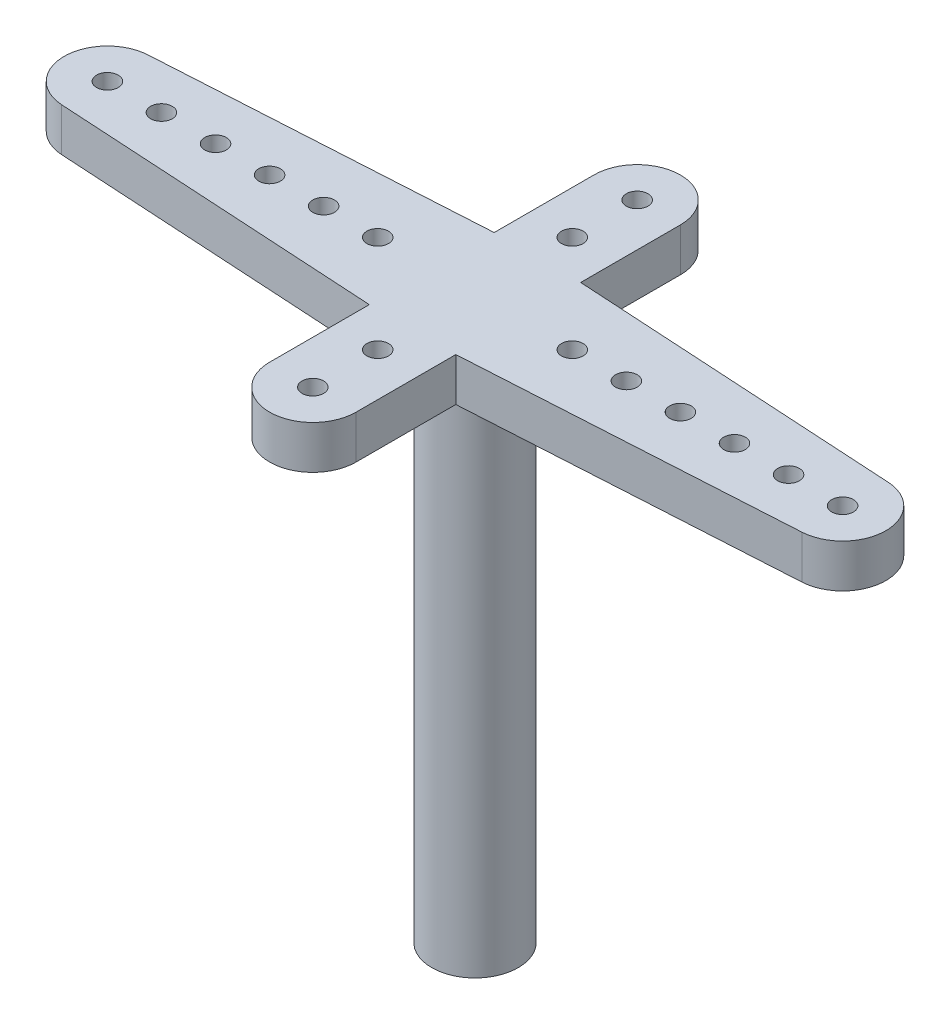
ISO-10303-21;
HEADER;
FILE_DESCRIPTION(('STEP AP214'),'2;1');
FILE_NAME('part.step','',(''),(''),'','','');
FILE_SCHEMA(('AUTOMOTIVE_DESIGN { 1 0 10303 214 1 1 1 1 }'));
ENDSEC;
DATA;
#1=APPLICATION_CONTEXT('core data for automotive mechanical design processes');
#2=APPLICATION_PROTOCOL_DEFINITION('international standard','automotive_design',2000,#1);
#3=PRODUCT_CONTEXT('',#1,'mechanical');
#4=PRODUCT('Part','Part','',(#3));
#5=PRODUCT_RELATED_PRODUCT_CATEGORY('part','',(#4));
#6=PRODUCT_DEFINITION_FORMATION('','',#4);
#7=PRODUCT_DEFINITION_CONTEXT('part definition',#1,'design');
#8=PRODUCT_DEFINITION('design','',#6,#7);
#9=PRODUCT_DEFINITION_SHAPE('','',#8);
#10=(LENGTH_UNIT() NAMED_UNIT(*) SI_UNIT(.MILLI.,.METRE.));
#11=(NAMED_UNIT(*) PLANE_ANGLE_UNIT() SI_UNIT($,.RADIAN.));
#12=(NAMED_UNIT(*) SI_UNIT($,.STERADIAN.) SOLID_ANGLE_UNIT());
#13=UNCERTAINTY_MEASURE_WITH_UNIT(LENGTH_MEASURE(1.E-05),#10,'distance_accuracy_value','');
#14=(GEOMETRIC_REPRESENTATION_CONTEXT(3) GLOBAL_UNCERTAINTY_ASSIGNED_CONTEXT((#13)) GLOBAL_UNIT_ASSIGNED_CONTEXT((#10,
#11,#12)) REPRESENTATION_CONTEXT('',''));
#15=CARTESIAN_POINT('',(0.,0.,0.));
#16=DIRECTION('',(0.,0.,1.));
#17=DIRECTION('',(1.,0.,0.));
#18=AXIS2_PLACEMENT_3D('',#15,#16,#17);
#19=CARTESIAN_POINT('',(17.,2.,0.));
#20=DIRECTION('',(0.,-1.,0.));
#21=DIRECTION('',(0.,0.,-1.));
#22=AXIS2_PLACEMENT_3D('',#19,#20,#21);
#23=PLANE('',#22);
#24=CARTESIAN_POINT('',(17.,2.,0.));
#25=DIRECTION('',(0.,1.,0.));
#26=DIRECTION('',(0.,0.,-1.));
#27=AXIS2_PLACEMENT_3D('',#24,#25,#26);
#28=CIRCLE('',#27,2.);
#29=CARTESIAN_POINT('',(17.1176470588235,2.,1.99653679393849));
#30=VERTEX_POINT('',#29);
#31=CARTESIAN_POINT('',(17.1176470588235,2.,-1.99653679393849));
#32=VERTEX_POINT('',#31);
#33=EDGE_CURVE('E180',#30,#32,#28,.T.);
#34=ORIENTED_EDGE('',*,*,#33,.T.);
#35=DIRECTION('',(-0.998268396969243,0.,-0.0588235294117646));
#36=VECTOR('',#35,1.);
#37=CARTESIAN_POINT('',(17.1176470588235,2.,-1.99653679393849));
#38=LINE('',#37,#36);
#39=CARTESIAN_POINT('',(2.,2.,-2.88735268984507));
#40=VERTEX_POINT('',#39);
#41=EDGE_CURVE('E108',#32,#40,#38,.T.);
#42=ORIENTED_EDGE('',*,*,#41,.T.);
#43=DIRECTION('',(0.,0.,-1.));
#44=VECTOR('',#43,1.);
#45=CARTESIAN_POINT('',(2.,2.,-7.5));
#46=LINE('',#45,#44);
#47=CARTESIAN_POINT('',(2.,2.,-7.5));
#48=VERTEX_POINT('',#47);
#49=EDGE_CURVE('E207',#40,#48,#46,.T.);
#50=ORIENTED_EDGE('',*,*,#49,.T.);
#51=CARTESIAN_POINT('',(0.,2.,-7.5));
#52=DIRECTION('',(0.,1.,0.));
#53=DIRECTION('',(0.,0.,-1.));
#54=AXIS2_PLACEMENT_3D('',#51,#52,#53);
#55=CIRCLE('',#54,2.);
#56=CARTESIAN_POINT('',(-2.,2.,-7.5));
#57=VERTEX_POINT('',#56);
#58=EDGE_CURVE('E226',#48,#57,#55,.T.);
#59=ORIENTED_EDGE('',*,*,#58,.T.);
#60=DIRECTION('',(0.,0.,1.));
#61=VECTOR('',#60,1.);
#62=CARTESIAN_POINT('',(-2.,2.,-7.5));
#63=LINE('',#62,#61);
#64=CARTESIAN_POINT('',(-2.,2.,-2.88735268984507));
#65=VERTEX_POINT('',#64);
#66=EDGE_CURVE('E223',#57,#65,#63,.T.);
#67=ORIENTED_EDGE('',*,*,#66,.T.);
#68=DIRECTION('',(-0.998268396969243,0.,0.0588235294117646));
#69=VECTOR('',#68,1.);
#70=CARTESIAN_POINT('',(-17.1176470588235,2.,-1.99653679393849));
#71=LINE('',#70,#69);
#72=CARTESIAN_POINT('',(-17.1176470588235,2.,-1.99653679393849));
#73=VERTEX_POINT('',#72);
#74=EDGE_CURVE('E225',#65,#73,#71,.T.);
#75=ORIENTED_EDGE('',*,*,#74,.T.);
#76=CARTESIAN_POINT('',(-17.,2.,0.));
#77=DIRECTION('',(0.,1.,0.));
#78=DIRECTION('',(0.,0.,1.));
#79=AXIS2_PLACEMENT_3D('',#76,#77,#78);
#80=CIRCLE('',#79,2.);
#81=CARTESIAN_POINT('',(-17.1176470588235,2.,1.99653679393849));
#82=VERTEX_POINT('',#81);
#83=EDGE_CURVE('E228',#73,#82,#80,.T.);
#84=ORIENTED_EDGE('',*,*,#83,.T.);
#85=DIRECTION('',(0.998268396969243,0.,0.0588235294117647));
#86=VECTOR('',#85,1.);
#87=CARTESIAN_POINT('',(-17.1176470588235,2.,1.99653679393849));
#88=LINE('',#87,#86);
#89=CARTESIAN_POINT('',(-2.,2.,2.88735268984507));
#90=VERTEX_POINT('',#89);
#91=EDGE_CURVE('E234',#82,#90,#88,.T.);
#92=ORIENTED_EDGE('',*,*,#91,.T.);
#93=DIRECTION('',(0.,0.,1.));
#94=VECTOR('',#93,1.);
#95=CARTESIAN_POINT('',(-2.,2.,7.5));
#96=LINE('',#95,#94);
#97=CARTESIAN_POINT('',(-2.,2.,7.5));
#98=VERTEX_POINT('',#97);
#99=EDGE_CURVE('E139',#90,#98,#96,.T.);
#100=ORIENTED_EDGE('',*,*,#99,.T.);
#101=CARTESIAN_POINT('',(0.,2.,7.5));
#102=DIRECTION('',(0.,1.,0.));
#103=DIRECTION('',(0.,0.,1.));
#104=AXIS2_PLACEMENT_3D('',#101,#102,#103);
#105=CIRCLE('',#104,2.);
#106=CARTESIAN_POINT('',(2.,2.,7.5));
#107=VERTEX_POINT('',#106);
#108=EDGE_CURVE('E133',#98,#107,#105,.T.);
#109=ORIENTED_EDGE('',*,*,#108,.T.);
#110=DIRECTION('',(0.,0.,-1.));
#111=VECTOR('',#110,1.);
#112=CARTESIAN_POINT('',(2.,2.,7.5));
#113=LINE('',#112,#111);
#114=CARTESIAN_POINT('',(2.,2.,2.88735268984507));
#115=VERTEX_POINT('',#114);
#116=EDGE_CURVE('E137',#107,#115,#113,.T.);
#117=ORIENTED_EDGE('',*,*,#116,.T.);
#118=DIRECTION('',(0.998268396969243,0.,-0.0588235294117647));
#119=VECTOR('',#118,1.);
#120=CARTESIAN_POINT('',(17.1176470588235,2.,1.99653679393849));
#121=LINE('',#120,#119);
#122=EDGE_CURVE('E53',#115,#30,#121,.T.);
#123=ORIENTED_EDGE('',*,*,#122,.T.);
#124=EDGE_LOOP('',(#34,#42,#50,#59,#67,#75,#84,#92,#100,#109,#117,#123));
#125=FACE_BOUND('',#124,.T.);
#126=CARTESIAN_POINT('',(-17.,2.,0.));
#127=DIRECTION('',(0.,1.,0.));
#128=DIRECTION('',(0.,0.,1.));
#129=AXIS2_PLACEMENT_3D('',#126,#127,#128);
#130=CIRCLE('',#129,0.499999999999999);
#131=CARTESIAN_POINT('',(-17.,2.,0.499999999999999));
#132=VERTEX_POINT('',#131);
#133=EDGE_CURVE('E161',#132,#132,#130,.T.);
#134=ORIENTED_EDGE('',*,*,#133,.F.);
#135=EDGE_LOOP('',(#134));
#136=FACE_BOUND('',#135,.T.);
#137=CARTESIAN_POINT('',(17.,2.,0.));
#138=DIRECTION('',(0.,1.,0.));
#139=DIRECTION('',(0.,0.,-1.));
#140=AXIS2_PLACEMENT_3D('',#137,#138,#139);
#141=CIRCLE('',#140,0.499999999999999);
#142=CARTESIAN_POINT('',(17.,2.,-0.499999999999999));
#143=VERTEX_POINT('',#142);
#144=EDGE_CURVE('E430',#143,#143,#141,.T.);
#145=ORIENTED_EDGE('',*,*,#144,.F.);
#146=EDGE_LOOP('',(#145));
#147=FACE_BOUND('',#146,.T.);
#148=CARTESIAN_POINT('',(-14.5,2.,0.));
#149=DIRECTION('',(0.,1.,0.));
#150=DIRECTION('',(0.,0.,1.));
#151=AXIS2_PLACEMENT_3D('',#148,#149,#150);
#152=CIRCLE('',#151,0.499999999999999);
#153=CARTESIAN_POINT('',(-14.5,2.,0.499999999999999));
#154=VERTEX_POINT('',#153);
#155=EDGE_CURVE('E424',#154,#154,#152,.T.);
#156=ORIENTED_EDGE('',*,*,#155,.F.);
#157=EDGE_LOOP('',(#156));
#158=FACE_BOUND('',#157,.T.);
#159=CARTESIAN_POINT('',(-12.,2.,0.));
#160=DIRECTION('',(0.,1.,0.));
#161=DIRECTION('',(0.,0.,1.));
#162=AXIS2_PLACEMENT_3D('',#159,#160,#161);
#163=CIRCLE('',#162,0.499999999999999);
#164=CARTESIAN_POINT('',(-12.,2.,0.499999999999999));
#165=VERTEX_POINT('',#164);
#166=EDGE_CURVE('E418',#165,#165,#163,.T.);
#167=ORIENTED_EDGE('',*,*,#166,.F.);
#168=EDGE_LOOP('',(#167));
#169=FACE_BOUND('',#168,.T.);
#170=CARTESIAN_POINT('',(-9.5,2.,0.));
#171=DIRECTION('',(0.,1.,0.));
#172=DIRECTION('',(0.,0.,1.));
#173=AXIS2_PLACEMENT_3D('',#170,#171,#172);
#174=CIRCLE('',#173,0.499999999999999);
#175=CARTESIAN_POINT('',(-9.5,2.,0.499999999999999));
#176=VERTEX_POINT('',#175);
#177=EDGE_CURVE('E412',#176,#176,#174,.T.);
#178=ORIENTED_EDGE('',*,*,#177,.F.);
#179=EDGE_LOOP('',(#178));
#180=FACE_BOUND('',#179,.T.);
#181=CARTESIAN_POINT('',(-7.,2.,0.));
#182=DIRECTION('',(0.,1.,0.));
#183=DIRECTION('',(0.,0.,1.));
#184=AXIS2_PLACEMENT_3D('',#181,#182,#183);
#185=CIRCLE('',#184,0.499999999999999);
#186=CARTESIAN_POINT('',(-7.,2.,0.499999999999999));
#187=VERTEX_POINT('',#186);
#188=EDGE_CURVE('E406',#187,#187,#185,.T.);
#189=ORIENTED_EDGE('',*,*,#188,.F.);
#190=EDGE_LOOP('',(#189));
#191=FACE_BOUND('',#190,.T.);
#192=CARTESIAN_POINT('',(-4.5,2.,0.));
#193=DIRECTION('',(0.,1.,0.));
#194=DIRECTION('',(0.,0.,1.));
#195=AXIS2_PLACEMENT_3D('',#192,#193,#194);
#196=CIRCLE('',#195,0.499999999999999);
#197=CARTESIAN_POINT('',(-4.5,2.,0.499999999999999));
#198=VERTEX_POINT('',#197);
#199=EDGE_CURVE('E400',#198,#198,#196,.T.);
#200=ORIENTED_EDGE('',*,*,#199,.F.);
#201=EDGE_LOOP('',(#200));
#202=FACE_BOUND('',#201,.T.);
#203=CARTESIAN_POINT('',(4.5,2.,0.));
#204=DIRECTION('',(0.,1.,0.));
#205=DIRECTION('',(0.,0.,-1.));
#206=AXIS2_PLACEMENT_3D('',#203,#204,#205);
#207=CIRCLE('',#206,0.499999999999999);
#208=CARTESIAN_POINT('',(4.5,2.,-0.499999999999999));
#209=VERTEX_POINT('',#208);
#210=EDGE_CURVE('E394',#209,#209,#207,.T.);
#211=ORIENTED_EDGE('',*,*,#210,.F.);
#212=EDGE_LOOP('',(#211));
#213=FACE_BOUND('',#212,.T.);
#214=CARTESIAN_POINT('',(7.,2.,0.));
#215=DIRECTION('',(0.,1.,0.));
#216=DIRECTION('',(0.,0.,-1.));
#217=AXIS2_PLACEMENT_3D('',#214,#215,#216);
#218=CIRCLE('',#217,0.499999999999999);
#219=CARTESIAN_POINT('',(7.,2.,-0.499999999999999));
#220=VERTEX_POINT('',#219);
#221=EDGE_CURVE('E388',#220,#220,#218,.T.);
#222=ORIENTED_EDGE('',*,*,#221,.F.);
#223=EDGE_LOOP('',(#222));
#224=FACE_BOUND('',#223,.T.);
#225=CARTESIAN_POINT('',(9.5,2.,0.));
#226=DIRECTION('',(0.,1.,0.));
#227=DIRECTION('',(0.,0.,-1.));
#228=AXIS2_PLACEMENT_3D('',#225,#226,#227);
#229=CIRCLE('',#228,0.499999999999999);
#230=CARTESIAN_POINT('',(9.5,2.,-0.499999999999999));
#231=VERTEX_POINT('',#230);
#232=EDGE_CURVE('E382',#231,#231,#229,.T.);
#233=ORIENTED_EDGE('',*,*,#232,.F.);
#234=EDGE_LOOP('',(#233));
#235=FACE_BOUND('',#234,.T.);
#236=CARTESIAN_POINT('',(12.,2.,0.));
#237=DIRECTION('',(0.,1.,0.));
#238=DIRECTION('',(0.,0.,-1.));
#239=AXIS2_PLACEMENT_3D('',#236,#237,#238);
#240=CIRCLE('',#239,0.499999999999999);
#241=CARTESIAN_POINT('',(12.,2.,-0.499999999999999));
#242=VERTEX_POINT('',#241);
#243=EDGE_CURVE('E376',#242,#242,#240,.T.);
#244=ORIENTED_EDGE('',*,*,#243,.F.);
#245=EDGE_LOOP('',(#244));
#246=FACE_BOUND('',#245,.T.);
#247=CARTESIAN_POINT('',(14.5,2.,0.));
#248=DIRECTION('',(0.,1.,0.));
#249=DIRECTION('',(0.,0.,-1.));
#250=AXIS2_PLACEMENT_3D('',#247,#248,#249);
#251=CIRCLE('',#250,0.499999999999999);
#252=CARTESIAN_POINT('',(14.5,2.,-0.499999999999999));
#253=VERTEX_POINT('',#252);
#254=EDGE_CURVE('E370',#253,#253,#251,.T.);
#255=ORIENTED_EDGE('',*,*,#254,.F.);
#256=EDGE_LOOP('',(#255));
#257=FACE_BOUND('',#256,.T.);
#258=CARTESIAN_POINT('',(0.,2.,-7.5));
#259=DIRECTION('',(0.,1.,0.));
#260=DIRECTION('',(0.,0.,1.));
#261=AXIS2_PLACEMENT_3D('',#258,#259,#260);
#262=CIRCLE('',#261,0.5);
#263=CARTESIAN_POINT('',(0.,2.,-7.));
#264=VERTEX_POINT('',#263);
#265=EDGE_CURVE('E364',#264,#264,#262,.T.);
#266=ORIENTED_EDGE('',*,*,#265,.F.);
#267=EDGE_LOOP('',(#266));
#268=FACE_BOUND('',#267,.T.);
#269=CARTESIAN_POINT('',(0.,2.,-4.5));
#270=DIRECTION('',(0.,1.,0.));
#271=DIRECTION('',(0.,0.,1.));
#272=AXIS2_PLACEMENT_3D('',#269,#270,#271);
#273=CIRCLE('',#272,0.5);
#274=CARTESIAN_POINT('',(0.,2.,-4.));
#275=VERTEX_POINT('',#274);
#276=EDGE_CURVE('E358',#275,#275,#273,.T.);
#277=ORIENTED_EDGE('',*,*,#276,.F.);
#278=EDGE_LOOP('',(#277));
#279=FACE_BOUND('',#278,.T.);
#280=CARTESIAN_POINT('',(0.,2.,4.5));
#281=DIRECTION('',(0.,1.,0.));
#282=DIRECTION('',(0.,0.,-1.));
#283=AXIS2_PLACEMENT_3D('',#280,#281,#282);
#284=CIRCLE('',#283,0.5);
#285=CARTESIAN_POINT('',(0.,2.,4.));
#286=VERTEX_POINT('',#285);
#287=EDGE_CURVE('E352',#286,#286,#284,.T.);
#288=ORIENTED_EDGE('',*,*,#287,.F.);
#289=EDGE_LOOP('',(#288));
#290=FACE_BOUND('',#289,.T.);
#291=CARTESIAN_POINT('',(0.,2.,7.5));
#292=DIRECTION('',(0.,1.,0.));
#293=DIRECTION('',(0.,0.,-1.));
#294=AXIS2_PLACEMENT_3D('',#291,#292,#293);
#295=CIRCLE('',#294,0.5);
#296=CARTESIAN_POINT('',(0.,2.,7.));
#297=VERTEX_POINT('',#296);
#298=EDGE_CURVE('E346',#297,#297,#295,.T.);
#299=ORIENTED_EDGE('',*,*,#298,.F.);
#300=EDGE_LOOP('',(#299));
#301=FACE_BOUND('',#300,.T.);
#302=ADVANCED_FACE('F36',(#125,#136,#147,#158,#169,#180,#191,#202,#213,#224,#235,#246,#257,#268,
#279,#290,#301),#23,.F.);
#303=CARTESIAN_POINT('',(17.,0.,0.));
#304=DIRECTION('',(0.,-1.,0.));
#305=DIRECTION('',(0.,0.,-1.));
#306=AXIS2_PLACEMENT_3D('',#303,#304,#305);
#307=PLANE('',#306);
#308=CARTESIAN_POINT('',(0.,0.,4.5));
#309=DIRECTION('',(0.,1.,0.));
#310=DIRECTION('',(0.,0.,-1.));
#311=AXIS2_PLACEMENT_3D('',#308,#309,#310);
#312=CIRCLE('',#311,0.5);
#313=CARTESIAN_POINT('',(0.,0.,4.));
#314=VERTEX_POINT('',#313);
#315=EDGE_CURVE('E349',#314,#314,#312,.T.);
#316=ORIENTED_EDGE('',*,*,#315,.T.);
#317=EDGE_LOOP('',(#316));
#318=FACE_BOUND('',#317,.T.);
#319=CARTESIAN_POINT('',(0.,0.,-7.5));
#320=DIRECTION('',(0.,1.,0.));
#321=DIRECTION('',(0.,0.,1.));
#322=AXIS2_PLACEMENT_3D('',#319,#320,#321);
#323=CIRCLE('',#322,0.5);
#324=CARTESIAN_POINT('',(0.,0.,-7.));
#325=VERTEX_POINT('',#324);
#326=EDGE_CURVE('E361',#325,#325,#323,.T.);
#327=ORIENTED_EDGE('',*,*,#326,.T.);
#328=EDGE_LOOP('',(#327));
#329=FACE_BOUND('',#328,.T.);
#330=CARTESIAN_POINT('',(12.,0.,0.));
#331=DIRECTION('',(0.,1.,0.));
#332=DIRECTION('',(0.,0.,-1.));
#333=AXIS2_PLACEMENT_3D('',#330,#331,#332);
#334=CIRCLE('',#333,0.499999999999999);
#335=CARTESIAN_POINT('',(12.,0.,-0.499999999999999));
#336=VERTEX_POINT('',#335);
#337=EDGE_CURVE('E373',#336,#336,#334,.T.);
#338=ORIENTED_EDGE('',*,*,#337,.T.);
#339=EDGE_LOOP('',(#338));
#340=FACE_BOUND('',#339,.T.);
#341=CARTESIAN_POINT('',(7.,0.,0.));
#342=DIRECTION('',(0.,1.,0.));
#343=DIRECTION('',(0.,0.,-1.));
#344=AXIS2_PLACEMENT_3D('',#341,#342,#343);
#345=CIRCLE('',#344,0.499999999999999);
#346=CARTESIAN_POINT('',(7.,0.,-0.499999999999999));
#347=VERTEX_POINT('',#346);
#348=EDGE_CURVE('E385',#347,#347,#345,.T.);
#349=ORIENTED_EDGE('',*,*,#348,.T.);
#350=EDGE_LOOP('',(#349));
#351=FACE_BOUND('',#350,.T.);
#352=CARTESIAN_POINT('',(-4.5,0.,0.));
#353=DIRECTION('',(0.,1.,0.));
#354=DIRECTION('',(0.,0.,1.));
#355=AXIS2_PLACEMENT_3D('',#352,#353,#354);
#356=CIRCLE('',#355,0.499999999999999);
#357=CARTESIAN_POINT('',(-4.5,0.,0.499999999999999));
#358=VERTEX_POINT('',#357);
#359=EDGE_CURVE('E397',#358,#358,#356,.T.);
#360=ORIENTED_EDGE('',*,*,#359,.T.);
#361=EDGE_LOOP('',(#360));
#362=FACE_BOUND('',#361,.T.);
#363=CARTESIAN_POINT('',(-9.5,0.,0.));
#364=DIRECTION('',(0.,1.,0.));
#365=DIRECTION('',(0.,0.,1.));
#366=AXIS2_PLACEMENT_3D('',#363,#364,#365);
#367=CIRCLE('',#366,0.499999999999999);
#368=CARTESIAN_POINT('',(-9.5,0.,0.499999999999999));
#369=VERTEX_POINT('',#368);
#370=EDGE_CURVE('E409',#369,#369,#367,.T.);
#371=ORIENTED_EDGE('',*,*,#370,.T.);
#372=EDGE_LOOP('',(#371));
#373=FACE_BOUND('',#372,.T.);
#374=CARTESIAN_POINT('',(-14.5,0.,0.));
#375=DIRECTION('',(0.,1.,0.));
#376=DIRECTION('',(0.,0.,1.));
#377=AXIS2_PLACEMENT_3D('',#374,#375,#376);
#378=CIRCLE('',#377,0.499999999999999);
#379=CARTESIAN_POINT('',(-14.5,0.,0.499999999999999));
#380=VERTEX_POINT('',#379);
#381=EDGE_CURVE('E421',#380,#380,#378,.T.);
#382=ORIENTED_EDGE('',*,*,#381,.T.);
#383=EDGE_LOOP('',(#382));
#384=FACE_BOUND('',#383,.T.);
#385=CARTESIAN_POINT('',(-17.,0.,0.));
#386=DIRECTION('',(0.,1.,0.));
#387=DIRECTION('',(0.,0.,1.));
#388=AXIS2_PLACEMENT_3D('',#385,#386,#387);
#389=CIRCLE('',#388,0.499999999999999);
#390=CARTESIAN_POINT('',(-17.,0.,0.499999999999999));
#391=VERTEX_POINT('',#390);
#392=EDGE_CURVE('E433',#391,#391,#389,.T.);
#393=ORIENTED_EDGE('',*,*,#392,.T.);
#394=EDGE_LOOP('',(#393));
#395=FACE_BOUND('',#394,.T.);
#396=CARTESIAN_POINT('',(17.,0.,0.));
#397=DIRECTION('',(0.,1.,0.));
#398=DIRECTION('',(0.,0.,-1.));
#399=AXIS2_PLACEMENT_3D('',#396,#397,#398);
#400=CIRCLE('',#399,2.);
#401=CARTESIAN_POINT('',(17.1176470588235,0.,1.99653679393849));
#402=VERTEX_POINT('',#401);
#403=CARTESIAN_POINT('',(17.1176470588235,0.,-1.99653679393849));
#404=VERTEX_POINT('',#403);
#405=EDGE_CURVE('E157',#402,#404,#400,.T.);
#406=ORIENTED_EDGE('',*,*,#405,.F.);
#407=DIRECTION('',(0.998268396969243,0.,-0.0588235294117647));
#408=VECTOR('',#407,1.);
#409=CARTESIAN_POINT('',(17.1176470588235,0.,1.99653679393849));
#410=LINE('',#409,#408);
#411=CARTESIAN_POINT('',(2.,0.,2.88735268984507));
#412=VERTEX_POINT('',#411);
#413=EDGE_CURVE('E100',#412,#402,#410,.T.);
#414=ORIENTED_EDGE('',*,*,#413,.F.);
#415=DIRECTION('',(0.,0.,-1.));
#416=VECTOR('',#415,1.);
#417=CARTESIAN_POINT('',(2.,0.,7.5));
#418=LINE('',#417,#416);
#419=CARTESIAN_POINT('',(2.,0.,7.5));
#420=VERTEX_POINT('',#419);
#421=EDGE_CURVE('E94',#420,#412,#418,.T.);
#422=ORIENTED_EDGE('',*,*,#421,.F.);
#423=CARTESIAN_POINT('',(0.,0.,7.5));
#424=DIRECTION('',(0.,1.,0.));
#425=DIRECTION('',(0.,0.,1.));
#426=AXIS2_PLACEMENT_3D('',#423,#424,#425);
#427=CIRCLE('',#426,2.);
#428=CARTESIAN_POINT('',(-2.,0.,7.5));
#429=VERTEX_POINT('',#428);
#430=EDGE_CURVE('E147',#429,#420,#427,.T.);
#431=ORIENTED_EDGE('',*,*,#430,.F.);
#432=DIRECTION('',(0.,0.,1.));
#433=VECTOR('',#432,1.);
#434=CARTESIAN_POINT('',(-2.,0.,7.5));
#435=LINE('',#434,#433);
#436=CARTESIAN_POINT('',(-2.,0.,2.88735268984507));
#437=VERTEX_POINT('',#436);
#438=EDGE_CURVE('E175',#437,#429,#435,.T.);
#439=ORIENTED_EDGE('',*,*,#438,.F.);
#440=DIRECTION('',(0.998268396969243,0.,0.0588235294117647));
#441=VECTOR('',#440,1.);
#442=CARTESIAN_POINT('',(-17.1176470588235,0.,1.99653679393849));
#443=LINE('',#442,#441);
#444=CARTESIAN_POINT('',(-17.1176470588235,0.,1.99653679393849));
#445=VERTEX_POINT('',#444);
#446=EDGE_CURVE('E173',#445,#437,#443,.T.);
#447=ORIENTED_EDGE('',*,*,#446,.F.);
#448=CARTESIAN_POINT('',(-17.,0.,0.));
#449=DIRECTION('',(0.,1.,0.));
#450=DIRECTION('',(0.,0.,1.));
#451=AXIS2_PLACEMENT_3D('',#448,#449,#450);
#452=CIRCLE('',#451,2.);
#453=CARTESIAN_POINT('',(-17.1176470588235,0.,-1.99653679393849));
#454=VERTEX_POINT('',#453);
#455=EDGE_CURVE('E171',#454,#445,#452,.T.);
#456=ORIENTED_EDGE('',*,*,#455,.F.);
#457=DIRECTION('',(-0.998268396969243,0.,0.0588235294117646));
#458=VECTOR('',#457,1.);
#459=CARTESIAN_POINT('',(-17.1176470588235,0.,-1.99653679393849));
#460=LINE('',#459,#458);
#461=CARTESIAN_POINT('',(-2.,0.,-2.88735268984507));
#462=VERTEX_POINT('',#461);
#463=EDGE_CURVE('E169',#462,#454,#460,.T.);
#464=ORIENTED_EDGE('',*,*,#463,.F.);
#465=DIRECTION('',(0.,0.,1.));
#466=VECTOR('',#465,1.);
#467=CARTESIAN_POINT('',(-2.,0.,-7.5));
#468=LINE('',#467,#466);
#469=CARTESIAN_POINT('',(-2.,0.,-7.5));
#470=VERTEX_POINT('',#469);
#471=EDGE_CURVE('E167',#470,#462,#468,.T.);
#472=ORIENTED_EDGE('',*,*,#471,.F.);
#473=CARTESIAN_POINT('',(0.,0.,-7.5));
#474=DIRECTION('',(0.,1.,0.));
#475=DIRECTION('',(0.,0.,-1.));
#476=AXIS2_PLACEMENT_3D('',#473,#474,#475);
#477=CIRCLE('',#476,2.);
#478=CARTESIAN_POINT('',(2.,0.,-7.5));
#479=VERTEX_POINT('',#478);
#480=EDGE_CURVE('E165',#479,#470,#477,.T.);
#481=ORIENTED_EDGE('',*,*,#480,.F.);
#482=DIRECTION('',(0.,0.,-1.));
#483=VECTOR('',#482,1.);
#484=CARTESIAN_POINT('',(2.,0.,-7.5));
#485=LINE('',#484,#483);
#486=CARTESIAN_POINT('',(2.,0.,-2.88735268984507));
#487=VERTEX_POINT('',#486);
#488=EDGE_CURVE('E163',#487,#479,#485,.T.);
#489=ORIENTED_EDGE('',*,*,#488,.F.);
#490=DIRECTION('',(-0.998268396969243,0.,-0.0588235294117646));
#491=VECTOR('',#490,1.);
#492=CARTESIAN_POINT('',(17.1176470588235,0.,-1.99653679393849));
#493=LINE('',#492,#491);
#494=EDGE_CURVE('E160',#404,#487,#493,.T.);
#495=ORIENTED_EDGE('',*,*,#494,.F.);
#496=EDGE_LOOP('',(#406,#414,#422,#431,#439,#447,#456,#464,#472,#481,#489,#495));
#497=FACE_BOUND('',#496,.T.);
#498=CARTESIAN_POINT('',(0.,0.,0.));
#499=DIRECTION('',(0.,-1.,0.));
#500=DIRECTION('',(0.,0.,-1.));
#501=AXIS2_PLACEMENT_3D('',#498,#499,#500);
#502=CIRCLE('',#501,2.);
#503=CARTESIAN_POINT('',(0.,0.,2.));
#504=VERTEX_POINT('',#503);
#505=EDGE_CURVE('E340',#504,#504,#502,.F.);
#506=ORIENTED_EDGE('',*,*,#505,.T.);
#507=EDGE_LOOP('',(#506));
#508=FACE_BOUND('',#507,.T.);
#509=CARTESIAN_POINT('',(17.,0.,0.));
#510=DIRECTION('',(0.,1.,0.));
#511=DIRECTION('',(0.,0.,-1.));
#512=AXIS2_PLACEMENT_3D('',#509,#510,#511);
#513=CIRCLE('',#512,0.499999999999999);
#514=CARTESIAN_POINT('',(17.,0.,-0.499999999999999));
#515=VERTEX_POINT('',#514);
#516=EDGE_CURVE('E427',#515,#515,#513,.T.);
#517=ORIENTED_EDGE('',*,*,#516,.T.);
#518=EDGE_LOOP('',(#517));
#519=FACE_BOUND('',#518,.T.);
#520=CARTESIAN_POINT('',(-12.,0.,0.));
#521=DIRECTION('',(0.,1.,0.));
#522=DIRECTION('',(0.,0.,1.));
#523=AXIS2_PLACEMENT_3D('',#520,#521,#522);
#524=CIRCLE('',#523,0.499999999999999);
#525=CARTESIAN_POINT('',(-12.,0.,0.499999999999999));
#526=VERTEX_POINT('',#525);
#527=EDGE_CURVE('E415',#526,#526,#524,.T.);
#528=ORIENTED_EDGE('',*,*,#527,.T.);
#529=EDGE_LOOP('',(#528));
#530=FACE_BOUND('',#529,.T.);
#531=CARTESIAN_POINT('',(-7.,0.,0.));
#532=DIRECTION('',(0.,1.,0.));
#533=DIRECTION('',(0.,0.,1.));
#534=AXIS2_PLACEMENT_3D('',#531,#532,#533);
#535=CIRCLE('',#534,0.499999999999999);
#536=CARTESIAN_POINT('',(-7.,0.,0.499999999999999));
#537=VERTEX_POINT('',#536);
#538=EDGE_CURVE('E403',#537,#537,#535,.T.);
#539=ORIENTED_EDGE('',*,*,#538,.T.);
#540=EDGE_LOOP('',(#539));
#541=FACE_BOUND('',#540,.T.);
#542=CARTESIAN_POINT('',(4.5,0.,0.));
#543=DIRECTION('',(0.,1.,0.));
#544=DIRECTION('',(0.,0.,-1.));
#545=AXIS2_PLACEMENT_3D('',#542,#543,#544);
#546=CIRCLE('',#545,0.499999999999999);
#547=CARTESIAN_POINT('',(4.5,0.,-0.499999999999999));
#548=VERTEX_POINT('',#547);
#549=EDGE_CURVE('E391',#548,#548,#546,.T.);
#550=ORIENTED_EDGE('',*,*,#549,.T.);
#551=EDGE_LOOP('',(#550));
#552=FACE_BOUND('',#551,.T.);
#553=CARTESIAN_POINT('',(9.5,0.,0.));
#554=DIRECTION('',(0.,1.,0.));
#555=DIRECTION('',(0.,0.,-1.));
#556=AXIS2_PLACEMENT_3D('',#553,#554,#555);
#557=CIRCLE('',#556,0.499999999999999);
#558=CARTESIAN_POINT('',(9.5,0.,-0.499999999999999));
#559=VERTEX_POINT('',#558);
#560=EDGE_CURVE('E379',#559,#559,#557,.T.);
#561=ORIENTED_EDGE('',*,*,#560,.T.);
#562=EDGE_LOOP('',(#561));
#563=FACE_BOUND('',#562,.T.);
#564=CARTESIAN_POINT('',(14.5,0.,0.));
#565=DIRECTION('',(0.,1.,0.));
#566=DIRECTION('',(0.,0.,-1.));
#567=AXIS2_PLACEMENT_3D('',#564,#565,#566);
#568=CIRCLE('',#567,0.499999999999999);
#569=CARTESIAN_POINT('',(14.5,0.,-0.499999999999999));
#570=VERTEX_POINT('',#569);
#571=EDGE_CURVE('E367',#570,#570,#568,.T.);
#572=ORIENTED_EDGE('',*,*,#571,.T.);
#573=EDGE_LOOP('',(#572));
#574=FACE_BOUND('',#573,.T.);
#575=CARTESIAN_POINT('',(0.,0.,-4.5));
#576=DIRECTION('',(0.,1.,0.));
#577=DIRECTION('',(0.,0.,1.));
#578=AXIS2_PLACEMENT_3D('',#575,#576,#577);
#579=CIRCLE('',#578,0.5);
#580=CARTESIAN_POINT('',(0.,0.,-4.));
#581=VERTEX_POINT('',#580);
#582=EDGE_CURVE('E355',#581,#581,#579,.T.);
#583=ORIENTED_EDGE('',*,*,#582,.T.);
#584=EDGE_LOOP('',(#583));
#585=FACE_BOUND('',#584,.T.);
#586=CARTESIAN_POINT('',(0.,0.,7.5));
#587=DIRECTION('',(0.,1.,0.));
#588=DIRECTION('',(0.,0.,-1.));
#589=AXIS2_PLACEMENT_3D('',#586,#587,#588);
#590=CIRCLE('',#589,0.5);
#591=CARTESIAN_POINT('',(0.,0.,7.));
#592=VERTEX_POINT('',#591);
#593=EDGE_CURVE('E343',#592,#592,#590,.T.);
#594=ORIENTED_EDGE('',*,*,#593,.T.);
#595=EDGE_LOOP('',(#594));
#596=FACE_BOUND('',#595,.T.);
#597=ADVANCED_FACE('F211',(#318,#329,#340,#351,#362,#373,#384,#395,#497,#508,#519,#530,#541,
#552,#563,#574,#585,#596),#307,.T.);
#598=CARTESIAN_POINT('',(17.,2.,0.));
#599=DIRECTION('',(0.,-1.,0.));
#600=DIRECTION('',(0.,0.,-1.));
#601=AXIS2_PLACEMENT_3D('',#598,#599,#600);
#602=CYLINDRICAL_SURFACE('',#601,2.);
#603=ORIENTED_EDGE('',*,*,#405,.T.);
#604=DIRECTION('',(0.,-1.,0.));
#605=VECTOR('',#604,1.);
#606=CARTESIAN_POINT('',(17.1176470588235,2.,-1.99653679393849));
#607=LINE('',#606,#605);
#608=EDGE_CURVE('E11',#32,#404,#607,.T.);
#609=ORIENTED_EDGE('',*,*,#608,.F.);
#610=ORIENTED_EDGE('',*,*,#33,.F.);
#611=DIRECTION('',(0.,-1.,0.));
#612=VECTOR('',#611,1.);
#613=CARTESIAN_POINT('',(17.1176470588235,2.,1.99653679393849));
#614=LINE('',#613,#612);
#615=EDGE_CURVE('E153',#30,#402,#614,.T.);
#616=ORIENTED_EDGE('',*,*,#615,.T.);
#617=EDGE_LOOP('',(#603,#609,#610,#616));
#618=FACE_BOUND('',#617,.T.);
#619=ADVANCED_FACE('F38',(#618),#602,.T.);
#620=CARTESIAN_POINT('',(17.1176470588235,2.,-1.99653679393849));
#621=DIRECTION('',(-0.0588235294117647,0.,0.998268396969244));
#622=DIRECTION('',(0.998268396969244,0.,0.0588235294117647));
#623=AXIS2_PLACEMENT_3D('',#620,#621,#622);
#624=PLANE('',#623);
#625=ORIENTED_EDGE('',*,*,#494,.T.);
#626=DIRECTION('',(0.,-1.,0.));
#627=VECTOR('',#626,1.);
#628=CARTESIAN_POINT('',(2.,2.,-2.88735268984507));
#629=LINE('',#628,#627);
#630=EDGE_CURVE('E45',#40,#487,#629,.T.);
#631=ORIENTED_EDGE('',*,*,#630,.F.);
#632=ORIENTED_EDGE('',*,*,#41,.F.);
#633=ORIENTED_EDGE('',*,*,#608,.T.);
#634=EDGE_LOOP('',(#625,#631,#632,#633));
#635=FACE_BOUND('',#634,.T.);
#636=ADVANCED_FACE('F667',(#635),#624,.F.);
#637=CARTESIAN_POINT('',(2.,2.,-7.5));
#638=DIRECTION('',(-1.,0.,0.));
#639=DIRECTION('',(0.,0.,1.));
#640=AXIS2_PLACEMENT_3D('',#637,#638,#639);
#641=PLANE('',#640);
#642=ORIENTED_EDGE('',*,*,#488,.T.);
#643=DIRECTION('',(0.,-1.,0.));
#644=VECTOR('',#643,1.);
#645=CARTESIAN_POINT('',(2.,2.,-7.5));
#646=LINE('',#645,#644);
#647=EDGE_CURVE('E199',#48,#479,#646,.T.);
#648=ORIENTED_EDGE('',*,*,#647,.F.);
#649=ORIENTED_EDGE('',*,*,#49,.F.);
#650=ORIENTED_EDGE('',*,*,#630,.T.);
#651=EDGE_LOOP('',(#642,#648,#649,#650));
#652=FACE_BOUND('',#651,.T.);
#653=ADVANCED_FACE('F205',(#652),#641,.F.);
#654=CARTESIAN_POINT('',(0.,2.,-7.5));
#655=DIRECTION('',(0.,-1.,0.));
#656=DIRECTION('',(0.,0.,-1.));
#657=AXIS2_PLACEMENT_3D('',#654,#655,#656);
#658=CYLINDRICAL_SURFACE('',#657,2.);
#659=ORIENTED_EDGE('',*,*,#480,.T.);
#660=DIRECTION('',(0.,-1.,0.));
#661=VECTOR('',#660,1.);
#662=CARTESIAN_POINT('',(-2.,2.,-7.5));
#663=LINE('',#662,#661);
#664=EDGE_CURVE('E196',#57,#470,#663,.T.);
#665=ORIENTED_EDGE('',*,*,#664,.F.);
#666=ORIENTED_EDGE('',*,*,#58,.F.);
#667=ORIENTED_EDGE('',*,*,#647,.T.);
#668=EDGE_LOOP('',(#659,#665,#666,#667));
#669=FACE_BOUND('',#668,.T.);
#670=ADVANCED_FACE('F217',(#669),#658,.T.);
#671=CARTESIAN_POINT('',(-2.,2.,-7.5));
#672=DIRECTION('',(1.,0.,0.));
#673=DIRECTION('',(0.,0.,-1.));
#674=AXIS2_PLACEMENT_3D('',#671,#672,#673);
#675=PLANE('',#674);
#676=ORIENTED_EDGE('',*,*,#471,.T.);
#677=DIRECTION('',(0.,-1.,0.));
#678=VECTOR('',#677,1.);
#679=CARTESIAN_POINT('',(-2.,2.,-2.88735268984507));
#680=LINE('',#679,#678);
#681=EDGE_CURVE('E193',#65,#462,#680,.T.);
#682=ORIENTED_EDGE('',*,*,#681,.F.);
#683=ORIENTED_EDGE('',*,*,#66,.F.);
#684=ORIENTED_EDGE('',*,*,#664,.T.);
#685=EDGE_LOOP('',(#676,#682,#683,#684));
#686=FACE_BOUND('',#685,.T.);
#687=ADVANCED_FACE('F221',(#686),#675,.F.);
#688=CARTESIAN_POINT('',(-17.1176470588235,2.,-1.99653679393849));
#689=DIRECTION('',(0.0588235294117647,0.,0.998268396969244));
#690=DIRECTION('',(0.998268396969244,0.,-0.0588235294117647));
#691=AXIS2_PLACEMENT_3D('',#688,#689,#690);
#692=PLANE('',#691);
#693=ORIENTED_EDGE('',*,*,#463,.T.);
#694=DIRECTION('',(0.,-1.,0.));
#695=VECTOR('',#694,1.);
#696=CARTESIAN_POINT('',(-17.1176470588235,2.,-1.99653679393849));
#697=LINE('',#696,#695);
#698=EDGE_CURVE('E190',#73,#454,#697,.T.);
#699=ORIENTED_EDGE('',*,*,#698,.F.);
#700=ORIENTED_EDGE('',*,*,#74,.F.);
#701=ORIENTED_EDGE('',*,*,#681,.T.);
#702=EDGE_LOOP('',(#693,#699,#700,#701));
#703=FACE_BOUND('',#702,.T.);
#704=ADVANCED_FACE('F632',(#703),#692,.F.);
#705=CARTESIAN_POINT('',(-17.,2.,0.));
#706=DIRECTION('',(0.,-1.,0.));
#707=DIRECTION('',(0.,0.,-1.));
#708=AXIS2_PLACEMENT_3D('',#705,#706,#707);
#709=CYLINDRICAL_SURFACE('',#708,2.);
#710=ORIENTED_EDGE('',*,*,#455,.T.);
#711=DIRECTION('',(0.,-1.,0.));
#712=VECTOR('',#711,1.);
#713=CARTESIAN_POINT('',(-17.1176470588235,2.,1.99653679393849));
#714=LINE('',#713,#712);
#715=EDGE_CURVE('E187',#82,#445,#714,.T.);
#716=ORIENTED_EDGE('',*,*,#715,.F.);
#717=ORIENTED_EDGE('',*,*,#83,.F.);
#718=ORIENTED_EDGE('',*,*,#698,.T.);
#719=EDGE_LOOP('',(#710,#716,#717,#718));
#720=FACE_BOUND('',#719,.T.);
#721=ADVANCED_FACE('F623',(#720),#709,.T.);
#722=CARTESIAN_POINT('',(-17.1176470588235,2.,1.99653679393849));
#723=DIRECTION('',(0.0588235294117647,0.,-0.998268396969244));
#724=DIRECTION('',(-0.998268396969244,0.,-0.0588235294117647));
#725=AXIS2_PLACEMENT_3D('',#722,#723,#724);
#726=PLANE('',#725);
#727=ORIENTED_EDGE('',*,*,#446,.T.);
#728=DIRECTION('',(0.,-1.,0.));
#729=VECTOR('',#728,1.);
#730=CARTESIAN_POINT('',(-2.,2.,2.88735268984507));
#731=LINE('',#730,#729);
#732=EDGE_CURVE('E184',#90,#437,#731,.T.);
#733=ORIENTED_EDGE('',*,*,#732,.F.);
#734=ORIENTED_EDGE('',*,*,#91,.F.);
#735=ORIENTED_EDGE('',*,*,#715,.T.);
#736=EDGE_LOOP('',(#727,#733,#734,#735));
#737=FACE_BOUND('',#736,.T.);
#738=ADVANCED_FACE('F240',(#737),#726,.F.);
#739=CARTESIAN_POINT('',(-2.,2.,7.5));
#740=DIRECTION('',(1.,0.,0.));
#741=DIRECTION('',(0.,0.,-1.));
#742=AXIS2_PLACEMENT_3D('',#739,#740,#741);
#743=PLANE('',#742);
#744=ORIENTED_EDGE('',*,*,#438,.T.);
#745=DIRECTION('',(0.,-1.,0.));
#746=VECTOR('',#745,1.);
#747=CARTESIAN_POINT('',(-2.,2.,7.5));
#748=LINE('',#747,#746);
#749=EDGE_CURVE('E148',#98,#429,#748,.T.);
#750=ORIENTED_EDGE('',*,*,#749,.F.);
#751=ORIENTED_EDGE('',*,*,#99,.F.);
#752=ORIENTED_EDGE('',*,*,#732,.T.);
#753=EDGE_LOOP('',(#744,#750,#751,#752));
#754=FACE_BOUND('',#753,.T.);
#755=ADVANCED_FACE('F244',(#754),#743,.F.);
#756=CARTESIAN_POINT('',(0.,2.,7.5));
#757=DIRECTION('',(0.,-1.,0.));
#758=DIRECTION('',(0.,0.,-1.));
#759=AXIS2_PLACEMENT_3D('',#756,#757,#758);
#760=CYLINDRICAL_SURFACE('',#759,2.);
#761=ORIENTED_EDGE('',*,*,#430,.T.);
#762=DIRECTION('',(0.,-1.,0.));
#763=VECTOR('',#762,1.);
#764=CARTESIAN_POINT('',(2.,2.,7.5));
#765=LINE('',#764,#763);
#766=EDGE_CURVE('E144',#107,#420,#765,.T.);
#767=ORIENTED_EDGE('',*,*,#766,.F.);
#768=ORIENTED_EDGE('',*,*,#108,.F.);
#769=ORIENTED_EDGE('',*,*,#749,.T.);
#770=EDGE_LOOP('',(#761,#767,#768,#769));
#771=FACE_BOUND('',#770,.T.);
#772=ADVANCED_FACE('F145',(#771),#760,.T.);
#773=CARTESIAN_POINT('',(2.,2.,7.5));
#774=DIRECTION('',(-1.,0.,0.));
#775=DIRECTION('',(0.,0.,1.));
#776=AXIS2_PLACEMENT_3D('',#773,#774,#775);
#777=PLANE('',#776);
#778=ORIENTED_EDGE('',*,*,#421,.T.);
#779=DIRECTION('',(0.,-1.,0.));
#780=VECTOR('',#779,1.);
#781=CARTESIAN_POINT('',(2.,2.,2.88735268984507));
#782=LINE('',#781,#780);
#783=EDGE_CURVE('E149',#115,#412,#782,.T.);
#784=ORIENTED_EDGE('',*,*,#783,.F.);
#785=ORIENTED_EDGE('',*,*,#116,.F.);
#786=ORIENTED_EDGE('',*,*,#766,.T.);
#787=EDGE_LOOP('',(#778,#784,#785,#786));
#788=FACE_BOUND('',#787,.T.);
#789=ADVANCED_FACE('F151',(#788),#777,.F.);
#790=CARTESIAN_POINT('',(17.1176470588235,2.,1.99653679393849));
#791=DIRECTION('',(-0.0588235294117647,0.,-0.998268396969244));
#792=DIRECTION('',(-0.998268396969244,0.,0.0588235294117647));
#793=AXIS2_PLACEMENT_3D('',#790,#791,#792);
#794=PLANE('',#793);
#795=ORIENTED_EDGE('',*,*,#413,.T.);
#796=ORIENTED_EDGE('',*,*,#615,.F.);
#797=ORIENTED_EDGE('',*,*,#122,.F.);
#798=ORIENTED_EDGE('',*,*,#783,.T.);
#799=EDGE_LOOP('',(#795,#796,#797,#798));
#800=FACE_BOUND('',#799,.T.);
#801=ADVANCED_FACE('F248',(#800),#794,.F.);
#802=CARTESIAN_POINT('',(-17.,2.,0.));
#803=DIRECTION('',(0.,-1.,0.));
#804=DIRECTION('',(0.,0.,-1.));
#805=AXIS2_PLACEMENT_3D('',#802,#803,#804);
#806=CYLINDRICAL_SURFACE('',#805,0.499999999999999);
#807=ORIENTED_EDGE('',*,*,#133,.T.);
#808=EDGE_LOOP('',(#807));
#809=FACE_BOUND('',#808,.T.);
#810=ORIENTED_EDGE('',*,*,#392,.F.);
#811=EDGE_LOOP('',(#810));
#812=FACE_BOUND('',#811,.T.);
#813=ADVANCED_FACE('F250',(#809,#812),#806,.F.);
#814=CARTESIAN_POINT('',(17.,2.,0.));
#815=DIRECTION('',(0.,-1.,0.));
#816=DIRECTION('',(0.,0.,-1.));
#817=AXIS2_PLACEMENT_3D('',#814,#815,#816);
#818=CYLINDRICAL_SURFACE('',#817,0.499999999999999);
#819=ORIENTED_EDGE('',*,*,#144,.T.);
#820=EDGE_LOOP('',(#819));
#821=FACE_BOUND('',#820,.T.);
#822=ORIENTED_EDGE('',*,*,#516,.F.);
#823=EDGE_LOOP('',(#822));
#824=FACE_BOUND('',#823,.T.);
#825=ADVANCED_FACE('F256',(#821,#824),#818,.F.);
#826=CARTESIAN_POINT('',(-14.5,2.,0.));
#827=DIRECTION('',(0.,-1.,0.));
#828=DIRECTION('',(0.,0.,-1.));
#829=AXIS2_PLACEMENT_3D('',#826,#827,#828);
#830=CYLINDRICAL_SURFACE('',#829,0.499999999999999);
#831=ORIENTED_EDGE('',*,*,#155,.T.);
#832=EDGE_LOOP('',(#831));
#833=FACE_BOUND('',#832,.T.);
#834=ORIENTED_EDGE('',*,*,#381,.F.);
#835=EDGE_LOOP('',(#834));
#836=FACE_BOUND('',#835,.T.);
#837=ADVANCED_FACE('F270',(#833,#836),#830,.F.);
#838=CARTESIAN_POINT('',(-12.,2.,0.));
#839=DIRECTION('',(0.,-1.,0.));
#840=DIRECTION('',(0.,0.,-1.));
#841=AXIS2_PLACEMENT_3D('',#838,#839,#840);
#842=CYLINDRICAL_SURFACE('',#841,0.499999999999999);
#843=ORIENTED_EDGE('',*,*,#166,.T.);
#844=EDGE_LOOP('',(#843));
#845=FACE_BOUND('',#844,.T.);
#846=ORIENTED_EDGE('',*,*,#527,.F.);
#847=EDGE_LOOP('',(#846));
#848=FACE_BOUND('',#847,.T.);
#849=ADVANCED_FACE('F274',(#845,#848),#842,.F.);
#850=CARTESIAN_POINT('',(-9.5,2.,0.));
#851=DIRECTION('',(0.,-1.,0.));
#852=DIRECTION('',(0.,0.,-1.));
#853=AXIS2_PLACEMENT_3D('',#850,#851,#852);
#854=CYLINDRICAL_SURFACE('',#853,0.499999999999999);
#855=ORIENTED_EDGE('',*,*,#177,.T.);
#856=EDGE_LOOP('',(#855));
#857=FACE_BOUND('',#856,.T.);
#858=ORIENTED_EDGE('',*,*,#370,.F.);
#859=EDGE_LOOP('',(#858));
#860=FACE_BOUND('',#859,.T.);
#861=ADVANCED_FACE('F278',(#857,#860),#854,.F.);
#862=CARTESIAN_POINT('',(-7.,2.,0.));
#863=DIRECTION('',(0.,-1.,0.));
#864=DIRECTION('',(0.,0.,-1.));
#865=AXIS2_PLACEMENT_3D('',#862,#863,#864);
#866=CYLINDRICAL_SURFACE('',#865,0.499999999999999);
#867=ORIENTED_EDGE('',*,*,#188,.T.);
#868=EDGE_LOOP('',(#867));
#869=FACE_BOUND('',#868,.T.);
#870=ORIENTED_EDGE('',*,*,#538,.F.);
#871=EDGE_LOOP('',(#870));
#872=FACE_BOUND('',#871,.T.);
#873=ADVANCED_FACE('F282',(#869,#872),#866,.F.);
#874=CARTESIAN_POINT('',(-4.5,2.,0.));
#875=DIRECTION('',(0.,-1.,0.));
#876=DIRECTION('',(0.,0.,-1.));
#877=AXIS2_PLACEMENT_3D('',#874,#875,#876);
#878=CYLINDRICAL_SURFACE('',#877,0.499999999999999);
#879=ORIENTED_EDGE('',*,*,#199,.T.);
#880=EDGE_LOOP('',(#879));
#881=FACE_BOUND('',#880,.T.);
#882=ORIENTED_EDGE('',*,*,#359,.F.);
#883=EDGE_LOOP('',(#882));
#884=FACE_BOUND('',#883,.T.);
#885=ADVANCED_FACE('F286',(#881,#884),#878,.F.);
#886=CARTESIAN_POINT('',(4.5,2.,0.));
#887=DIRECTION('',(0.,-1.,0.));
#888=DIRECTION('',(0.,0.,-1.));
#889=AXIS2_PLACEMENT_3D('',#886,#887,#888);
#890=CYLINDRICAL_SURFACE('',#889,0.499999999999999);
#891=ORIENTED_EDGE('',*,*,#210,.T.);
#892=EDGE_LOOP('',(#891));
#893=FACE_BOUND('',#892,.T.);
#894=ORIENTED_EDGE('',*,*,#549,.F.);
#895=EDGE_LOOP('',(#894));
#896=FACE_BOUND('',#895,.T.);
#897=ADVANCED_FACE('F290',(#893,#896),#890,.F.);
#898=CARTESIAN_POINT('',(7.,2.,0.));
#899=DIRECTION('',(0.,-1.,0.));
#900=DIRECTION('',(0.,0.,-1.));
#901=AXIS2_PLACEMENT_3D('',#898,#899,#900);
#902=CYLINDRICAL_SURFACE('',#901,0.499999999999999);
#903=ORIENTED_EDGE('',*,*,#221,.T.);
#904=EDGE_LOOP('',(#903));
#905=FACE_BOUND('',#904,.T.);
#906=ORIENTED_EDGE('',*,*,#348,.F.);
#907=EDGE_LOOP('',(#906));
#908=FACE_BOUND('',#907,.T.);
#909=ADVANCED_FACE('F294',(#905,#908),#902,.F.);
#910=CARTESIAN_POINT('',(9.5,2.,0.));
#911=DIRECTION('',(0.,-1.,0.));
#912=DIRECTION('',(0.,0.,-1.));
#913=AXIS2_PLACEMENT_3D('',#910,#911,#912);
#914=CYLINDRICAL_SURFACE('',#913,0.499999999999999);
#915=ORIENTED_EDGE('',*,*,#232,.T.);
#916=EDGE_LOOP('',(#915));
#917=FACE_BOUND('',#916,.T.);
#918=ORIENTED_EDGE('',*,*,#560,.F.);
#919=EDGE_LOOP('',(#918));
#920=FACE_BOUND('',#919,.T.);
#921=ADVANCED_FACE('F298',(#917,#920),#914,.F.);
#922=CARTESIAN_POINT('',(12.,2.,0.));
#923=DIRECTION('',(0.,-1.,0.));
#924=DIRECTION('',(0.,0.,-1.));
#925=AXIS2_PLACEMENT_3D('',#922,#923,#924);
#926=CYLINDRICAL_SURFACE('',#925,0.499999999999999);
#927=ORIENTED_EDGE('',*,*,#243,.T.);
#928=EDGE_LOOP('',(#927));
#929=FACE_BOUND('',#928,.T.);
#930=ORIENTED_EDGE('',*,*,#337,.F.);
#931=EDGE_LOOP('',(#930));
#932=FACE_BOUND('',#931,.T.);
#933=ADVANCED_FACE('F302',(#929,#932),#926,.F.);
#934=CARTESIAN_POINT('',(14.5,2.,0.));
#935=DIRECTION('',(0.,-1.,0.));
#936=DIRECTION('',(0.,0.,-1.));
#937=AXIS2_PLACEMENT_3D('',#934,#935,#936);
#938=CYLINDRICAL_SURFACE('',#937,0.499999999999999);
#939=ORIENTED_EDGE('',*,*,#254,.T.);
#940=EDGE_LOOP('',(#939));
#941=FACE_BOUND('',#940,.T.);
#942=ORIENTED_EDGE('',*,*,#571,.F.);
#943=EDGE_LOOP('',(#942));
#944=FACE_BOUND('',#943,.T.);
#945=ADVANCED_FACE('F306',(#941,#944),#938,.F.);
#946=CARTESIAN_POINT('',(0.,2.,-7.5));
#947=DIRECTION('',(0.,-1.,0.));
#948=DIRECTION('',(0.,0.,-1.));
#949=AXIS2_PLACEMENT_3D('',#946,#947,#948);
#950=CYLINDRICAL_SURFACE('',#949,0.5);
#951=ORIENTED_EDGE('',*,*,#265,.T.);
#952=EDGE_LOOP('',(#951));
#953=FACE_BOUND('',#952,.T.);
#954=ORIENTED_EDGE('',*,*,#326,.F.);
#955=EDGE_LOOP('',(#954));
#956=FACE_BOUND('',#955,.T.);
#957=ADVANCED_FACE('F310',(#953,#956),#950,.F.);
#958=CARTESIAN_POINT('',(0.,2.,-4.5));
#959=DIRECTION('',(0.,-1.,0.));
#960=DIRECTION('',(0.,0.,-1.));
#961=AXIS2_PLACEMENT_3D('',#958,#959,#960);
#962=CYLINDRICAL_SURFACE('',#961,0.5);
#963=ORIENTED_EDGE('',*,*,#276,.T.);
#964=EDGE_LOOP('',(#963));
#965=FACE_BOUND('',#964,.T.);
#966=ORIENTED_EDGE('',*,*,#582,.F.);
#967=EDGE_LOOP('',(#966));
#968=FACE_BOUND('',#967,.T.);
#969=ADVANCED_FACE('F314',(#965,#968),#962,.F.);
#970=CARTESIAN_POINT('',(0.,2.,4.5));
#971=DIRECTION('',(0.,-1.,0.));
#972=DIRECTION('',(0.,0.,-1.));
#973=AXIS2_PLACEMENT_3D('',#970,#971,#972);
#974=CYLINDRICAL_SURFACE('',#973,0.5);
#975=ORIENTED_EDGE('',*,*,#287,.T.);
#976=EDGE_LOOP('',(#975));
#977=FACE_BOUND('',#976,.T.);
#978=ORIENTED_EDGE('',*,*,#315,.F.);
#979=EDGE_LOOP('',(#978));
#980=FACE_BOUND('',#979,.T.);
#981=ADVANCED_FACE('F318',(#977,#980),#974,.F.);
#982=CARTESIAN_POINT('',(0.,2.,7.5));
#983=DIRECTION('',(0.,-1.,0.));
#984=DIRECTION('',(0.,0.,-1.));
#985=AXIS2_PLACEMENT_3D('',#982,#983,#984);
#986=CYLINDRICAL_SURFACE('',#985,0.5);
#987=ORIENTED_EDGE('',*,*,#298,.T.);
#988=EDGE_LOOP('',(#987));
#989=FACE_BOUND('',#988,.T.);
#990=ORIENTED_EDGE('',*,*,#593,.F.);
#991=EDGE_LOOP('',(#990));
#992=FACE_BOUND('',#991,.T.);
#993=ADVANCED_FACE('F322',(#989,#992),#986,.F.);
#994=CARTESIAN_POINT('',(0.,-24.,0.));
#995=DIRECTION('',(0.,1.,0.));
#996=DIRECTION('',(0.,0.,1.));
#997=AXIS2_PLACEMENT_3D('',#994,#995,#996);
#998=CYLINDRICAL_SURFACE('',#997,2.);
#999=CARTESIAN_POINT('',(0.,-24.,0.));
#1000=DIRECTION('',(0.,-1.,0.));
#1001=DIRECTION('',(0.,0.,-1.));
#1002=AXIS2_PLACEMENT_3D('',#999,#1000,#1001);
#1003=CIRCLE('',#1002,2.);
#1004=CARTESIAN_POINT('',(0.,-24.,2.));
#1005=VERTEX_POINT('',#1004);
#1006=EDGE_CURVE('E338',#1005,#1005,#1003,.T.);
#1007=CARTESIAN_POINT('',(0.,0.,2.));
#1008=CARTESIAN_POINT('',(0.,-0.249999999999997,2.));
#1009=CARTESIAN_POINT('',(0.,-0.499999999999997,2.));
#1010=CARTESIAN_POINT('',(0.,-0.999999999999997,2.));
#1011=CARTESIAN_POINT('',(0.,-1.25,2.));
#1012=CARTESIAN_POINT('',(0.,-1.75,2.));
#1013=CARTESIAN_POINT('',(0.,-2.,2.));
#1014=CARTESIAN_POINT('',(0.,-2.5,2.));
#1015=CARTESIAN_POINT('',(0.,-2.75,2.));
#1016=CARTESIAN_POINT('',(0.,-3.25,2.));
#1017=CARTESIAN_POINT('',(0.,-3.5,2.));
#1018=CARTESIAN_POINT('',(0.,-4.,2.));
#1019=CARTESIAN_POINT('',(0.,-4.25,2.));
#1020=CARTESIAN_POINT('',(0.,-4.75,2.));
#1021=CARTESIAN_POINT('',(0.,-5.,2.));
#1022=CARTESIAN_POINT('',(0.,-5.5,2.));
#1023=CARTESIAN_POINT('',(0.,-5.75,2.));
#1024=CARTESIAN_POINT('',(0.,-6.25,2.));
#1025=CARTESIAN_POINT('',(0.,-6.5,2.));
#1026=CARTESIAN_POINT('',(0.,-7.,2.));
#1027=CARTESIAN_POINT('',(0.,-7.25,2.));
#1028=CARTESIAN_POINT('',(0.,-7.75,2.));
#1029=CARTESIAN_POINT('',(0.,-8.,2.));
#1030=CARTESIAN_POINT('',(0.,-8.5,2.));
#1031=CARTESIAN_POINT('',(0.,-8.75,2.));
#1032=CARTESIAN_POINT('',(0.,-9.25,2.));
#1033=CARTESIAN_POINT('',(0.,-9.5,2.));
#1034=CARTESIAN_POINT('',(0.,-10.,2.));
#1035=CARTESIAN_POINT('',(0.,-10.25,2.));
#1036=CARTESIAN_POINT('',(0.,-10.75,2.));
#1037=CARTESIAN_POINT('',(0.,-11.,2.));
#1038=CARTESIAN_POINT('',(0.,-11.5,2.));
#1039=CARTESIAN_POINT('',(0.,-11.75,2.));
#1040=CARTESIAN_POINT('',(0.,-12.25,2.));
#1041=CARTESIAN_POINT('',(0.,-12.5,2.));
#1042=CARTESIAN_POINT('',(0.,-13.,2.));
#1043=CARTESIAN_POINT('',(0.,-13.25,2.));
#1044=CARTESIAN_POINT('',(0.,-13.75,2.));
#1045=CARTESIAN_POINT('',(0.,-14.,2.));
#1046=CARTESIAN_POINT('',(0.,-14.5,2.));
#1047=CARTESIAN_POINT('',(0.,-14.75,2.));
#1048=CARTESIAN_POINT('',(0.,-15.25,2.));
#1049=CARTESIAN_POINT('',(0.,-15.5,2.));
#1050=CARTESIAN_POINT('',(0.,-16.,2.));
#1051=CARTESIAN_POINT('',(0.,-16.25,2.));
#1052=CARTESIAN_POINT('',(0.,-16.75,2.));
#1053=CARTESIAN_POINT('',(0.,-17.,2.));
#1054=CARTESIAN_POINT('',(0.,-17.5,2.));
#1055=CARTESIAN_POINT('',(0.,-17.75,2.));
#1056=CARTESIAN_POINT('',(0.,-18.25,2.));
#1057=CARTESIAN_POINT('',(0.,-18.5,2.));
#1058=CARTESIAN_POINT('',(0.,-19.,2.));
#1059=CARTESIAN_POINT('',(0.,-19.25,2.));
#1060=CARTESIAN_POINT('',(0.,-19.75,2.));
#1061=CARTESIAN_POINT('',(0.,-20.,2.));
#1062=CARTESIAN_POINT('',(0.,-20.5,2.));
#1063=CARTESIAN_POINT('',(0.,-20.75,2.));
#1064=CARTESIAN_POINT('',(0.,-21.25,2.));
#1065=CARTESIAN_POINT('',(0.,-21.5,2.));
#1066=CARTESIAN_POINT('',(0.,-22.,2.));
#1067=CARTESIAN_POINT('',(0.,-22.25,2.));
#1068=CARTESIAN_POINT('',(0.,-22.75,2.));
#1069=CARTESIAN_POINT('',(0.,-23.,2.));
#1070=CARTESIAN_POINT('',(0.,-23.5,2.));
#1071=CARTESIAN_POINT('',(0.,-23.75,2.));
#1072=CARTESIAN_POINT('',(0.,-24.,2.));
#1073=B_SPLINE_CURVE_WITH_KNOTS('',3,(#1007,#1008,#1009,#1010,#1011,#1012,#1013,#1014,#1015,
#1016,#1017,#1018,#1019,#1020,#1021,#1022,#1023,#1024,#1025,#1026,#1027,#1028,#1029,#1030,#1031,
#1032,#1033,#1034,#1035,#1036,#1037,#1038,#1039,#1040,#1041,#1042,#1043,#1044,#1045,#1046,#1047,
#1048,#1049,#1050,#1051,#1052,#1053,#1054,#1055,#1056,#1057,#1058,#1059,#1060,#1061,#1062,#1063,
#1064,#1065,#1066,#1067,#1068,#1069,#1070,#1071,#1072),.UNSPECIFIED.,.F.,.F.,(4,2,2,2,2,2,2,2,2,
2,2,2,2,2,2,2,2,2,2,2,2,2,2,2,2,2,2,2,2,2,2,2,4),(0.,0.750000000000001,1.5,2.25,3.,3.75,4.5,
5.25,6.,6.75,7.5,8.25,9.,9.75,10.5,11.25,12.,12.75,13.5,14.25,15.,15.75,16.5,17.25,18.,18.75,
19.5,20.25,21.,21.75,22.5,23.25,24.),.UNSPECIFIED.);
#1074=EDGE_CURVE('BSEAM326',#504,#1005,#1073,.T.);
#1075=ORIENTED_EDGE('',*,*,#505,.F.);
#1076=ORIENTED_EDGE('',*,*,#1006,.F.);
#1077=ORIENTED_EDGE('',*,*,#1074,.T.);
#1078=ORIENTED_EDGE('',*,*,#1074,.F.);
#1079=EDGE_LOOP('',(#1075,#1077,#1076,#1078));
#1080=FACE_BOUND('',#1079,.T.);
#1081=ADVANCED_FACE('F326',(#1080),#998,.T.);
#1082=CARTESIAN_POINT('',(0.,-24.,0.));
#1083=DIRECTION('',(0.,-1.,0.));
#1084=DIRECTION('',(0.,0.,-1.));
#1085=AXIS2_PLACEMENT_3D('',#1082,#1083,#1084);
#1086=PLANE('',#1085);
#1087=ORIENTED_EDGE('',*,*,#1006,.T.);
#1088=EDGE_LOOP('',(#1087));
#1089=FACE_BOUND('',#1088,.T.);
#1090=ADVANCED_FACE('F330',(#1089),#1086,.T.);
#1091=CLOSED_SHELL('',(#302,#597,#619,#636,#653,#670,#687,#704,#721,#738,#755,#772,#789,#801,
#813,#825,#837,#849,#861,#873,#885,#897,#909,#921,#933,#945,#957,#969,#981,#993,#1081,#1090));
#1092=MANIFOLD_SOLID_BREP('B2',#1091);
#1093=ADVANCED_BREP_SHAPE_REPRESENTATION('',(#18,#1092),#14);
#1094=SHAPE_DEFINITION_REPRESENTATION(#9,#1093);
ENDSEC;
END-ISO-10303-21;
